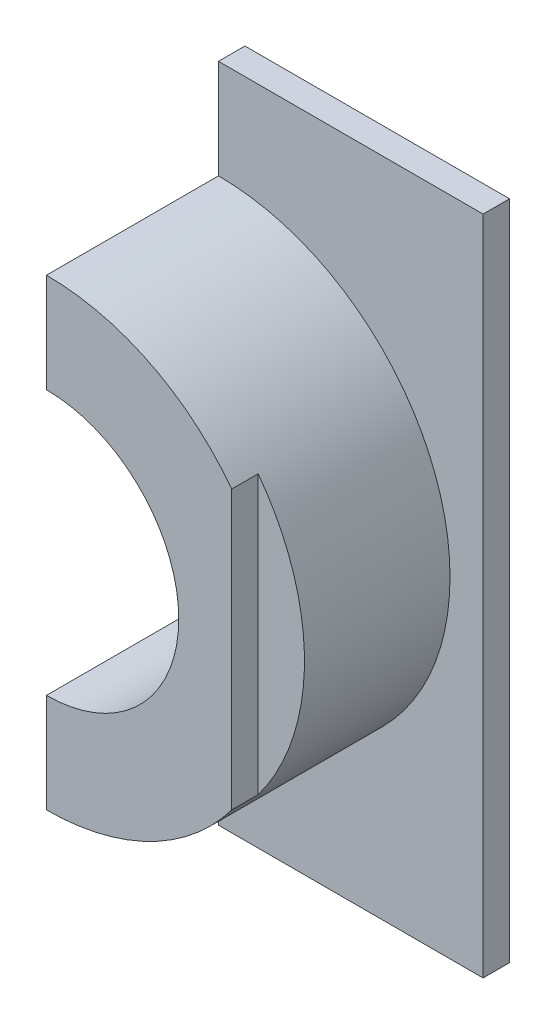
ISO-10303-21;
HEADER;
FILE_DESCRIPTION(('STEP AP214'),'2;1');
FILE_NAME('part.step','',(''),(''),'','','');
FILE_SCHEMA(('AUTOMOTIVE_DESIGN { 1 0 10303 214 1 1 1 1 }'));
ENDSEC;
DATA;
#1=APPLICATION_CONTEXT('core data for automotive mechanical design processes');
#2=APPLICATION_PROTOCOL_DEFINITION('international standard','automotive_design',2000,#1);
#3=PRODUCT_CONTEXT('',#1,'mechanical');
#4=PRODUCT('Part','Part','',(#3));
#5=PRODUCT_RELATED_PRODUCT_CATEGORY('part','',(#4));
#6=PRODUCT_DEFINITION_FORMATION('','',#4);
#7=PRODUCT_DEFINITION_CONTEXT('part definition',#1,'design');
#8=PRODUCT_DEFINITION('design','',#6,#7);
#9=PRODUCT_DEFINITION_SHAPE('','',#8);
#10=(LENGTH_UNIT() NAMED_UNIT(*) SI_UNIT(.MILLI.,.METRE.));
#11=(NAMED_UNIT(*) PLANE_ANGLE_UNIT() SI_UNIT($,.RADIAN.));
#12=(NAMED_UNIT(*) SI_UNIT($,.STERADIAN.) SOLID_ANGLE_UNIT());
#13=UNCERTAINTY_MEASURE_WITH_UNIT(LENGTH_MEASURE(1.E-05),#10,'distance_accuracy_value','');
#14=(GEOMETRIC_REPRESENTATION_CONTEXT(3) GLOBAL_UNCERTAINTY_ASSIGNED_CONTEXT((#13)) GLOBAL_UNIT_ASSIGNED_CONTEXT((#10,
#11,#12)) REPRESENTATION_CONTEXT('',''));
#15=CARTESIAN_POINT('',(0.,0.,0.));
#16=DIRECTION('',(0.,0.,1.));
#17=DIRECTION('',(1.,0.,0.));
#18=AXIS2_PLACEMENT_3D('',#15,#16,#17);
#19=CARTESIAN_POINT('',(-0.2,0.,1.204159457879));
#20=DIRECTION('',(0.,0.,-1.));
#21=DIRECTION('',(-1.,0.,0.));
#22=AXIS2_PLACEMENT_3D('',#19,#20,#21);
#23=CYLINDRICAL_SURFACE('',#22,0.2);
#24=CARTESIAN_POINT('',(-0.2,0.,0.3));
#25=DIRECTION('',(0.,0.,1.));
#26=DIRECTION('',(1.,0.,0.));
#27=AXIS2_PLACEMENT_3D('',#24,#25,#26);
#28=CIRCLE('',#27,0.2);
#29=CARTESIAN_POINT('',(-0.2,-0.2,0.3));
#30=VERTEX_POINT('',#29);
#31=CARTESIAN_POINT('',(-0.2,0.2,0.3));
#32=VERTEX_POINT('',#31);
#33=EDGE_CURVE('E176',#30,#32,#28,.T.);
#34=ORIENTED_EDGE('',*,*,#33,.T.);
#35=DIRECTION('',(0.,0.,-1.));
#36=VECTOR('',#35,1.);
#37=CARTESIAN_POINT('',(-0.2,0.2,1.204159457879));
#38=LINE('',#37,#36);
#39=CARTESIAN_POINT('',(-0.2,0.2,0.));
#40=VERTEX_POINT('',#39);
#41=EDGE_CURVE('E145',#32,#40,#38,.T.);
#42=ORIENTED_EDGE('',*,*,#41,.T.);
#43=CARTESIAN_POINT('',(-0.2,0.,0.));
#44=DIRECTION('',(0.,0.,1.));
#45=DIRECTION('',(1.,0.,0.));
#46=AXIS2_PLACEMENT_3D('',#43,#44,#45);
#47=CIRCLE('',#46,0.2);
#48=CARTESIAN_POINT('',(-0.2,-0.2,0.));
#49=VERTEX_POINT('',#48);
#50=EDGE_CURVE('E130',#49,#40,#47,.T.);
#51=ORIENTED_EDGE('',*,*,#50,.F.);
#52=DIRECTION('',(0.,0.,-1.));
#53=VECTOR('',#52,1.);
#54=CARTESIAN_POINT('',(-0.2,-0.2,1.204159457879));
#55=LINE('',#54,#53);
#56=EDGE_CURVE('E199',#30,#49,#55,.T.);
#57=ORIENTED_EDGE('',*,*,#56,.F.);
#58=EDGE_LOOP('',(#34,#42,#51,#57));
#59=FACE_BOUND('',#58,.T.);
#60=ADVANCED_FACE('F17',(#59),#23,.F.);
#61=CARTESIAN_POINT('',(-0.2,-0.5,0.04));
#62=DIRECTION('',(0.,1.,0.));
#63=DIRECTION('',(1.,0.,0.));
#64=AXIS2_PLACEMENT_3D('',#61,#62,#63);
#65=PLANE('',#64);
#66=DIRECTION('',(1.,0.,0.));
#67=VECTOR('',#66,1.);
#68=CARTESIAN_POINT('',(-0.2,-0.5,0.));
#69=LINE('',#68,#67);
#70=CARTESIAN_POINT('',(-0.2,-0.5,0.));
#71=VERTEX_POINT('',#70);
#72=CARTESIAN_POINT('',(0.2,-0.5,0.));
#73=VERTEX_POINT('',#72);
#74=EDGE_CURVE('E37',#71,#73,#69,.T.);
#75=ORIENTED_EDGE('',*,*,#74,.T.);
#76=DIRECTION('',(0.,0.,-1.));
#77=VECTOR('',#76,1.);
#78=CARTESIAN_POINT('',(0.2,-0.5,0.04));
#79=LINE('',#78,#77);
#80=CARTESIAN_POINT('',(0.2,-0.5,0.04));
#81=VERTEX_POINT('',#80);
#82=EDGE_CURVE('E169',#81,#73,#79,.T.);
#83=ORIENTED_EDGE('',*,*,#82,.F.);
#84=DIRECTION('',(1.,0.,0.));
#85=VECTOR('',#84,1.);
#86=CARTESIAN_POINT('',(-0.2,-0.5,0.04));
#87=LINE('',#86,#85);
#88=CARTESIAN_POINT('',(-0.2,-0.5,0.04));
#89=VERTEX_POINT('',#88);
#90=EDGE_CURVE('E11',#89,#81,#87,.T.);
#91=ORIENTED_EDGE('',*,*,#90,.F.);
#92=DIRECTION('',(0.,0.,-1.));
#93=VECTOR('',#92,1.);
#94=CARTESIAN_POINT('',(-0.2,-0.5,0.04));
#95=LINE('',#94,#93);
#96=EDGE_CURVE('E155',#89,#71,#95,.T.);
#97=ORIENTED_EDGE('',*,*,#96,.T.);
#98=EDGE_LOOP('',(#75,#83,#91,#97));
#99=FACE_BOUND('',#98,.T.);
#100=ADVANCED_FACE('F192',(#99),#65,.F.);
#101=CARTESIAN_POINT('',(-0.2,-0.5,0.04));
#102=DIRECTION('',(0.,0.,1.));
#103=DIRECTION('',(1.,0.,0.));
#104=AXIS2_PLACEMENT_3D('',#101,#102,#103);
#105=PLANE('',#104);
#106=DIRECTION('',(0.,1.,0.));
#107=VECTOR('',#106,1.);
#108=CARTESIAN_POINT('',(0.2,-0.5,0.04));
#109=LINE('',#108,#107);
#110=CARTESIAN_POINT('',(0.2,0.5,0.04));
#111=VERTEX_POINT('',#110);
#112=EDGE_CURVE('E161',#81,#111,#109,.T.);
#113=ORIENTED_EDGE('',*,*,#112,.T.);
#114=DIRECTION('',(-1.,0.,0.));
#115=VECTOR('',#114,1.);
#116=CARTESIAN_POINT('',(0.2,0.5,0.04));
#117=LINE('',#116,#115);
#118=CARTESIAN_POINT('',(-0.2,0.5,0.04));
#119=VERTEX_POINT('',#118);
#120=EDGE_CURVE('E25',#111,#119,#117,.T.);
#121=ORIENTED_EDGE('',*,*,#120,.T.);
#122=DIRECTION('',(0.,-1.,0.));
#123=VECTOR('',#122,1.);
#124=CARTESIAN_POINT('',(-0.2,0.5,0.04));
#125=LINE('',#124,#123);
#126=CARTESIAN_POINT('',(-0.2,0.35,0.04));
#127=VERTEX_POINT('',#126);
#128=EDGE_CURVE('E138',#119,#127,#125,.T.);
#129=ORIENTED_EDGE('',*,*,#128,.T.);
#130=CARTESIAN_POINT('',(-0.2,0.,0.04));
#131=DIRECTION('',(0.,0.,-1.));
#132=DIRECTION('',(-1.,0.,0.));
#133=AXIS2_PLACEMENT_3D('',#130,#131,#132);
#134=CIRCLE('',#133,0.35);
#135=CARTESIAN_POINT('',(-0.2,-0.35,0.04));
#136=VERTEX_POINT('',#135);
#137=EDGE_CURVE('E214',#127,#136,#134,.T.);
#138=ORIENTED_EDGE('',*,*,#137,.T.);
#139=DIRECTION('',(0.,-1.,0.));
#140=VECTOR('',#139,1.);
#141=CARTESIAN_POINT('',(-0.2,0.5,0.04));
#142=LINE('',#141,#140);
#143=EDGE_CURVE('E146',#136,#89,#142,.T.);
#144=ORIENTED_EDGE('',*,*,#143,.T.);
#145=ORIENTED_EDGE('',*,*,#90,.T.);
#146=EDGE_LOOP('',(#113,#121,#129,#138,#144,#145));
#147=FACE_BOUND('',#146,.T.);
#148=ADVANCED_FACE('F183',(#147),#105,.T.);
#149=CARTESIAN_POINT('',(0.2,0.5,0.04));
#150=DIRECTION('',(0.,-1.,0.));
#151=DIRECTION('',(0.,0.,-1.));
#152=AXIS2_PLACEMENT_3D('',#149,#150,#151);
#153=PLANE('',#152);
#154=DIRECTION('',(-1.,0.,0.));
#155=VECTOR('',#154,1.);
#156=CARTESIAN_POINT('',(0.2,0.5,0.));
#157=LINE('',#156,#155);
#158=CARTESIAN_POINT('',(0.2,0.5,0.));
#159=VERTEX_POINT('',#158);
#160=CARTESIAN_POINT('',(-0.2,0.5,0.));
#161=VERTEX_POINT('',#160);
#162=EDGE_CURVE('E119',#159,#161,#157,.T.);
#163=ORIENTED_EDGE('',*,*,#162,.T.);
#164=DIRECTION('',(0.,0.,-1.));
#165=VECTOR('',#164,1.);
#166=CARTESIAN_POINT('',(-0.2,0.5,0.04));
#167=LINE('',#166,#165);
#168=EDGE_CURVE('E122',#119,#161,#167,.T.);
#169=ORIENTED_EDGE('',*,*,#168,.F.);
#170=ORIENTED_EDGE('',*,*,#120,.F.);
#171=DIRECTION('',(0.,0.,-1.));
#172=VECTOR('',#171,1.);
#173=CARTESIAN_POINT('',(0.2,0.5,0.04));
#174=LINE('',#173,#172);
#175=EDGE_CURVE('E125',#111,#159,#174,.T.);
#176=ORIENTED_EDGE('',*,*,#175,.T.);
#177=EDGE_LOOP('',(#163,#169,#170,#176));
#178=FACE_BOUND('',#177,.T.);
#179=ADVANCED_FACE('F121',(#178),#153,.F.);
#180=CARTESIAN_POINT('',(-0.2,-0.35,0.));
#181=DIRECTION('',(0.,0.,1.));
#182=DIRECTION('',(1.,0.,0.));
#183=AXIS2_PLACEMENT_3D('',#180,#181,#182);
#184=PLANE('',#183);
#185=DIRECTION('',(0.,-1.,0.));
#186=VECTOR('',#185,1.);
#187=CARTESIAN_POINT('',(-0.2,0.35,0.));
#188=LINE('',#187,#186);
#189=EDGE_CURVE('E189',#49,#71,#188,.T.);
#190=ORIENTED_EDGE('',*,*,#189,.F.);
#191=ORIENTED_EDGE('',*,*,#50,.T.);
#192=DIRECTION('',(0.,-1.,0.));
#193=VECTOR('',#192,1.);
#194=CARTESIAN_POINT('',(-0.2,0.35,0.));
#195=LINE('',#194,#193);
#196=EDGE_CURVE('E136',#161,#40,#195,.T.);
#197=ORIENTED_EDGE('',*,*,#196,.F.);
#198=ORIENTED_EDGE('',*,*,#162,.F.);
#199=DIRECTION('',(0.,1.,0.));
#200=VECTOR('',#199,1.);
#201=CARTESIAN_POINT('',(0.2,-0.35,0.));
#202=LINE('',#201,#200);
#203=EDGE_CURVE('E173',#73,#159,#202,.T.);
#204=ORIENTED_EDGE('',*,*,#203,.F.);
#205=ORIENTED_EDGE('',*,*,#74,.F.);
#206=EDGE_LOOP('',(#190,#191,#197,#198,#204,#205));
#207=FACE_BOUND('',#206,.T.);
#208=ADVANCED_FACE('F142',(#207),#184,.F.);
#209=CARTESIAN_POINT('',(-0.2,-0.35,0.3));
#210=DIRECTION('',(0.,0.,1.));
#211=DIRECTION('',(1.,0.,0.));
#212=AXIS2_PLACEMENT_3D('',#209,#210,#211);
#213=PLANE('',#212);
#214=DIRECTION('',(0.,-1.,0.));
#215=VECTOR('',#214,1.);
#216=CARTESIAN_POINT('',(0.08,0.465,0.3));
#217=LINE('',#216,#215);
#218=CARTESIAN_POINT('',(0.08,0.21,0.3));
#219=VERTEX_POINT('',#218);
#220=CARTESIAN_POINT('',(0.08,-0.21,0.3));
#221=VERTEX_POINT('',#220);
#222=EDGE_CURVE('E278',#219,#221,#217,.T.);
#223=ORIENTED_EDGE('',*,*,#222,.F.);
#224=CARTESIAN_POINT('',(-0.2,0.,0.3));
#225=DIRECTION('',(0.,0.,-1.));
#226=DIRECTION('',(-1.,0.,0.));
#227=AXIS2_PLACEMENT_3D('',#224,#225,#226);
#228=CIRCLE('',#227,0.35);
#229=CARTESIAN_POINT('',(-0.2,0.35,0.3));
#230=VERTEX_POINT('',#229);
#231=EDGE_CURVE('E219',#230,#219,#228,.T.);
#232=ORIENTED_EDGE('',*,*,#231,.F.);
#233=DIRECTION('',(0.,-1.,0.));
#234=VECTOR('',#233,1.);
#235=CARTESIAN_POINT('',(-0.2,0.35,0.3));
#236=LINE('',#235,#234);
#237=EDGE_CURVE('E153',#230,#32,#236,.T.);
#238=ORIENTED_EDGE('',*,*,#237,.T.);
#239=ORIENTED_EDGE('',*,*,#33,.F.);
#240=DIRECTION('',(0.,-1.,0.));
#241=VECTOR('',#240,1.);
#242=CARTESIAN_POINT('',(-0.2,0.35,0.3));
#243=LINE('',#242,#241);
#244=CARTESIAN_POINT('',(-0.2,-0.35,0.3));
#245=VERTEX_POINT('',#244);
#246=EDGE_CURVE('E205',#30,#245,#243,.T.);
#247=ORIENTED_EDGE('',*,*,#246,.T.);
#248=CARTESIAN_POINT('',(-0.2,0.,0.3));
#249=DIRECTION('',(0.,0.,-1.));
#250=DIRECTION('',(-1.,0.,0.));
#251=AXIS2_PLACEMENT_3D('',#248,#249,#250);
#252=CIRCLE('',#251,0.35);
#253=EDGE_CURVE('E215',#221,#245,#252,.T.);
#254=ORIENTED_EDGE('',*,*,#253,.F.);
#255=EDGE_LOOP('',(#223,#232,#238,#239,#247,#254));
#256=FACE_BOUND('',#255,.T.);
#257=ADVANCED_FACE('F353',(#256),#213,.T.);
#258=CARTESIAN_POINT('',(0.2,-0.35,0.3));
#259=DIRECTION('',(-1.,0.,0.));
#260=DIRECTION('',(0.,0.,1.));
#261=AXIS2_PLACEMENT_3D('',#258,#259,#260);
#262=PLANE('',#261);
#263=ORIENTED_EDGE('',*,*,#175,.F.);
#264=ORIENTED_EDGE('',*,*,#112,.F.);
#265=ORIENTED_EDGE('',*,*,#82,.T.);
#266=ORIENTED_EDGE('',*,*,#203,.T.);
#267=EDGE_LOOP('',(#263,#264,#265,#266));
#268=FACE_BOUND('',#267,.T.);
#269=ADVANCED_FACE('F187',(#268),#262,.F.);
#270=CARTESIAN_POINT('',(-0.2,0.35,0.3));
#271=DIRECTION('',(1.,0.,0.));
#272=DIRECTION('',(0.,1.,0.));
#273=AXIS2_PLACEMENT_3D('',#270,#271,#272);
#274=PLANE('',#273);
#275=ORIENTED_EDGE('',*,*,#196,.T.);
#276=ORIENTED_EDGE('',*,*,#41,.F.);
#277=ORIENTED_EDGE('',*,*,#237,.F.);
#278=DIRECTION('',(0.,0.,-1.));
#279=VECTOR('',#278,1.);
#280=CARTESIAN_POINT('',(-0.2,0.35,0.3));
#281=LINE('',#280,#279);
#282=EDGE_CURVE('E216',#230,#127,#281,.T.);
#283=ORIENTED_EDGE('',*,*,#282,.T.);
#284=ORIENTED_EDGE('',*,*,#128,.F.);
#285=ORIENTED_EDGE('',*,*,#168,.T.);
#286=EDGE_LOOP('',(#275,#276,#277,#283,#284,#285));
#287=FACE_BOUND('',#286,.T.);
#288=ADVANCED_FACE('F134',(#287),#274,.F.);
#289=CARTESIAN_POINT('',(-0.2,0.35,0.3));
#290=DIRECTION('',(1.,0.,0.));
#291=DIRECTION('',(0.,1.,0.));
#292=AXIS2_PLACEMENT_3D('',#289,#290,#291);
#293=PLANE('',#292);
#294=ORIENTED_EDGE('',*,*,#246,.F.);
#295=ORIENTED_EDGE('',*,*,#56,.T.);
#296=ORIENTED_EDGE('',*,*,#189,.T.);
#297=ORIENTED_EDGE('',*,*,#96,.F.);
#298=ORIENTED_EDGE('',*,*,#143,.F.);
#299=DIRECTION('',(0.,0.,-1.));
#300=VECTOR('',#299,1.);
#301=CARTESIAN_POINT('',(-0.2,-0.35,0.3));
#302=LINE('',#301,#300);
#303=EDGE_CURVE('E210',#245,#136,#302,.T.);
#304=ORIENTED_EDGE('',*,*,#303,.F.);
#305=EDGE_LOOP('',(#294,#295,#296,#297,#298,#304));
#306=FACE_BOUND('',#305,.T.);
#307=ADVANCED_FACE('F197',(#306),#293,.F.);
#308=CARTESIAN_POINT('',(-0.2,0.,0.04));
#309=DIRECTION('',(0.,0.,1.));
#310=DIRECTION('',(1.,0.,0.));
#311=AXIS2_PLACEMENT_3D('',#308,#309,#310);
#312=CYLINDRICAL_SURFACE('',#311,0.35);
#313=DIRECTION('',(0.,0.,1.));
#314=VECTOR('',#313,1.);
#315=CARTESIAN_POINT('',(0.08,0.21,0.04));
#316=LINE('',#315,#314);
#317=CARTESIAN_POINT('',(0.08,0.21,0.26));
#318=VERTEX_POINT('',#317);
#319=EDGE_CURVE('E273',#318,#219,#316,.T.);
#320=ORIENTED_EDGE('',*,*,#319,.F.);
#321=CARTESIAN_POINT('',(-0.2,0.,0.26));
#322=DIRECTION('',(0.,0.,1.));
#323=DIRECTION('',(1.,0.,0.));
#324=AXIS2_PLACEMENT_3D('',#321,#322,#323);
#325=CIRCLE('',#324,0.35);
#326=CARTESIAN_POINT('',(0.08,-0.21,0.26));
#327=VERTEX_POINT('',#326);
#328=EDGE_CURVE('E269',#327,#318,#325,.T.);
#329=ORIENTED_EDGE('',*,*,#328,.F.);
#330=DIRECTION('',(0.,0.,1.));
#331=VECTOR('',#330,1.);
#332=CARTESIAN_POINT('',(0.08,-0.21,0.04));
#333=LINE('',#332,#331);
#334=EDGE_CURVE('E209',#327,#221,#333,.T.);
#335=ORIENTED_EDGE('',*,*,#334,.T.);
#336=ORIENTED_EDGE('',*,*,#253,.T.);
#337=ORIENTED_EDGE('',*,*,#303,.T.);
#338=ORIENTED_EDGE('',*,*,#137,.F.);
#339=ORIENTED_EDGE('',*,*,#282,.F.);
#340=ORIENTED_EDGE('',*,*,#231,.T.);
#341=EDGE_LOOP('',(#320,#329,#335,#336,#337,#338,#339,#340));
#342=FACE_BOUND('',#341,.T.);
#343=ADVANCED_FACE('F334',(#342),#312,.T.);
#344=CARTESIAN_POINT('',(0.08,0.465,0.3));
#345=DIRECTION('',(1.,0.,0.));
#346=DIRECTION('',(0.,1.,0.));
#347=AXIS2_PLACEMENT_3D('',#344,#345,#346);
#348=PLANE('',#347);
#349=ORIENTED_EDGE('',*,*,#319,.T.);
#350=ORIENTED_EDGE('',*,*,#222,.T.);
#351=ORIENTED_EDGE('',*,*,#334,.F.);
#352=DIRECTION('',(0.,-1.,0.));
#353=VECTOR('',#352,1.);
#354=CARTESIAN_POINT('',(0.08,0.465,0.26));
#355=LINE('',#354,#353);
#356=EDGE_CURVE('E313',#318,#327,#355,.T.);
#357=ORIENTED_EDGE('',*,*,#356,.F.);
#358=EDGE_LOOP('',(#349,#350,#351,#357));
#359=FACE_BOUND('',#358,.T.);
#360=ADVANCED_FACE('F332',(#359),#348,.T.);
#361=CARTESIAN_POINT('',(0.8,0.,0.26));
#362=DIRECTION('',(0.,0.,1.));
#363=DIRECTION('',(1.,0.,0.));
#364=AXIS2_PLACEMENT_3D('',#361,#362,#363);
#365=PLANE('',#364);
#366=ORIENTED_EDGE('',*,*,#356,.T.);
#367=ORIENTED_EDGE('',*,*,#328,.T.);
#368=EDGE_LOOP('',(#366,#367));
#369=FACE_BOUND('',#368,.T.);
#370=ADVANCED_FACE('F330',(#369),#365,.T.);
#371=CLOSED_SHELL('',(#60,#100,#148,#179,#208,#257,#269,#288,#307,#343,#360,#370));
#372=MANIFOLD_SOLID_BREP('B1',#371);
#373=ADVANCED_BREP_SHAPE_REPRESENTATION('',(#18,#372),#14);
#374=SHAPE_DEFINITION_REPRESENTATION(#9,#373);
ENDSEC;
END-ISO-10303-21;
